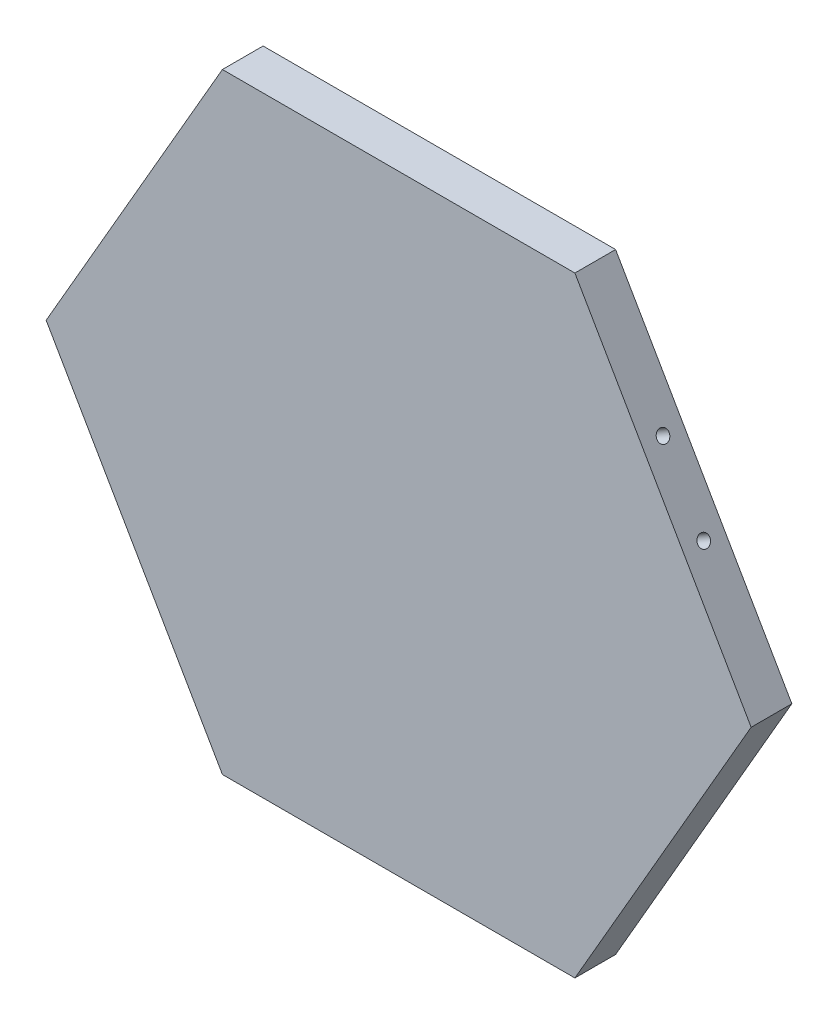
ISO-10303-21;
HEADER;
FILE_DESCRIPTION(('STEP AP214'),'2;1');
FILE_NAME('part.step','',(''),(''),'','','');
FILE_SCHEMA(('AUTOMOTIVE_DESIGN { 1 0 10303 214 1 1 1 1 }'));
ENDSEC;
DATA;
#1=APPLICATION_CONTEXT('core data for automotive mechanical design processes');
#2=APPLICATION_PROTOCOL_DEFINITION('international standard','automotive_design',2000,#1);
#3=PRODUCT_CONTEXT('',#1,'mechanical');
#4=PRODUCT('Part','Part','',(#3));
#5=PRODUCT_RELATED_PRODUCT_CATEGORY('part','',(#4));
#6=PRODUCT_DEFINITION_FORMATION('','',#4);
#7=PRODUCT_DEFINITION_CONTEXT('part definition',#1,'design');
#8=PRODUCT_DEFINITION('design','',#6,#7);
#9=PRODUCT_DEFINITION_SHAPE('','',#8);
#10=(LENGTH_UNIT() NAMED_UNIT(*) SI_UNIT(.MILLI.,.METRE.));
#11=(NAMED_UNIT(*) PLANE_ANGLE_UNIT() SI_UNIT($,.RADIAN.));
#12=(NAMED_UNIT(*) SI_UNIT($,.STERADIAN.) SOLID_ANGLE_UNIT());
#13=UNCERTAINTY_MEASURE_WITH_UNIT(LENGTH_MEASURE(1.E-05),#10,'distance_accuracy_value','');
#14=(GEOMETRIC_REPRESENTATION_CONTEXT(3) GLOBAL_UNCERTAINTY_ASSIGNED_CONTEXT((#13)) GLOBAL_UNIT_ASSIGNED_CONTEXT((#10,
#11,#12)) REPRESENTATION_CONTEXT('',''));
#15=CARTESIAN_POINT('',(0.,0.,0.));
#16=DIRECTION('',(0.,0.,1.));
#17=DIRECTION('',(1.,0.,0.));
#18=AXIS2_PLACEMENT_3D('',#15,#16,#17);
#19=CARTESIAN_POINT('',(43.3012701892226,-74.9999999999991,10.));
#20=DIRECTION('',(-0.866025403784441,0.499999999999995,0.));
#21=DIRECTION('',(-0.499999999999995,-0.866025403784441,0.));
#22=AXIS2_PLACEMENT_3D('',#19,#20,#21);
#23=PLANE('',#22);
#24=DIRECTION('',(0.499999999999995,0.866025403784441,0.));
#25=VECTOR('',#24,1.);
#26=CARTESIAN_POINT('',(43.3012701892226,-74.9999999999991,0.));
#27=LINE('',#26,#25);
#28=CARTESIAN_POINT('',(43.3012701892226,-74.9999999999991,0.));
#29=VERTEX_POINT('',#28);
#30=CARTESIAN_POINT('',(86.6025403784434,0.,0.));
#31=VERTEX_POINT('',#30);
#32=EDGE_CURVE('E132',#29,#31,#27,.T.);
#33=ORIENTED_EDGE('',*,*,#32,.T.);
#34=DIRECTION('',(0.,0.,-1.));
#35=VECTOR('',#34,1.);
#36=CARTESIAN_POINT('',(86.6025403784434,0.,10.));
#37=LINE('',#36,#35);
#38=CARTESIAN_POINT('',(86.6025403784434,0.,10.));
#39=VERTEX_POINT('',#38);
#40=EDGE_CURVE('E11',#39,#31,#37,.T.);
#41=ORIENTED_EDGE('',*,*,#40,.F.);
#42=DIRECTION('',(0.499999999999995,0.866025403784441,0.));
#43=VECTOR('',#42,1.);
#44=CARTESIAN_POINT('',(43.3012701892226,-74.9999999999991,10.));
#45=LINE('',#44,#43);
#46=CARTESIAN_POINT('',(43.3012701892226,-74.9999999999991,10.));
#47=VERTEX_POINT('',#46);
#48=EDGE_CURVE('E149',#47,#39,#45,.T.);
#49=ORIENTED_EDGE('',*,*,#48,.F.);
#50=DIRECTION('',(0.,0.,-1.));
#51=VECTOR('',#50,1.);
#52=CARTESIAN_POINT('',(43.3012701892226,-74.9999999999991,10.));
#53=LINE('',#52,#51);
#54=EDGE_CURVE('E128',#47,#29,#53,.T.);
#55=ORIENTED_EDGE('',*,*,#54,.T.);
#56=EDGE_LOOP('',(#33,#41,#49,#55));
#57=FACE_BOUND('',#56,.T.);
#58=ADVANCED_FACE('F43',(#57),#23,.F.);
#59=CARTESIAN_POINT('',(86.6025403784434,0.,10.));
#60=DIRECTION('',(-0.866025403784438,-0.500000000000001,0.));
#61=DIRECTION('',(0.500000000000001,-0.866025403784438,0.));
#62=AXIS2_PLACEMENT_3D('',#59,#60,#61);
#63=PLANE('',#62);
#64=CARTESIAN_POINT('',(69.9519052838321,28.8397459621565,5.));
#65=DIRECTION('',(0.866025403784431,0.500000000000013,0.));
#66=DIRECTION('',(-0.500000000000013,0.866025403784431,0.));
#67=AXIS2_PLACEMENT_3D('',#64,#65,#66);
#68=CIRCLE('',#67,1.5);
#69=CARTESIAN_POINT('',(69.2019052838321,30.1387840678331,5.));
#70=VERTEX_POINT('',#69);
#71=EDGE_CURVE('E235',#70,#70,#68,.T.);
#72=ORIENTED_EDGE('',*,*,#71,.F.);
#73=EDGE_LOOP('',(#72));
#74=FACE_BOUND('',#73,.T.);
#75=CARTESIAN_POINT('',(59.9519052838318,46.1602540378451,5.));
#76=DIRECTION('',(0.866025403784431,0.500000000000013,0.));
#77=DIRECTION('',(-0.500000000000013,0.866025403784431,0.));
#78=AXIS2_PLACEMENT_3D('',#75,#76,#77);
#79=CIRCLE('',#78,1.5);
#80=CARTESIAN_POINT('',(59.2019052838318,47.4592921435217,5.));
#81=VERTEX_POINT('',#80);
#82=EDGE_CURVE('E243',#81,#81,#79,.T.);
#83=ORIENTED_EDGE('',*,*,#82,.F.);
#84=EDGE_LOOP('',(#83));
#85=FACE_BOUND('',#84,.T.);
#86=DIRECTION('',(-0.500000000000001,0.866025403784438,0.));
#87=VECTOR('',#86,1.);
#88=CARTESIAN_POINT('',(86.6025403784434,0.,0.));
#89=LINE('',#88,#87);
#90=CARTESIAN_POINT('',(43.3012701892215,74.9999999999997,0.));
#91=VERTEX_POINT('',#90);
#92=EDGE_CURVE('E136',#31,#91,#89,.T.);
#93=ORIENTED_EDGE('',*,*,#92,.T.);
#94=DIRECTION('',(0.,0.,-1.));
#95=VECTOR('',#94,1.);
#96=CARTESIAN_POINT('',(43.3012701892215,74.9999999999997,10.));
#97=LINE('',#96,#95);
#98=CARTESIAN_POINT('',(43.3012701892215,74.9999999999997,10.));
#99=VERTEX_POINT('',#98);
#100=EDGE_CURVE('E52',#99,#91,#97,.T.);
#101=ORIENTED_EDGE('',*,*,#100,.F.);
#102=DIRECTION('',(-0.500000000000001,0.866025403784438,0.));
#103=VECTOR('',#102,1.);
#104=CARTESIAN_POINT('',(86.6025403784434,0.,10.));
#105=LINE('',#104,#103);
#106=EDGE_CURVE('E97',#39,#99,#105,.T.);
#107=ORIENTED_EDGE('',*,*,#106,.F.);
#108=ORIENTED_EDGE('',*,*,#40,.T.);
#109=EDGE_LOOP('',(#93,#101,#107,#108));
#110=FACE_BOUND('',#109,.T.);
#111=ADVANCED_FACE('F180',(#74,#85,#110),#63,.F.);
#112=CARTESIAN_POINT('',(43.3012701892215,74.9999999999997,10.));
#113=DIRECTION('',(0.,-1.,0.));
#114=DIRECTION('',(1.,0.,0.));
#115=AXIS2_PLACEMENT_3D('',#112,#113,#114);
#116=PLANE('',#115);
#117=DIRECTION('',(-1.,0.,0.));
#118=VECTOR('',#117,1.);
#119=CARTESIAN_POINT('',(43.3012701892215,74.9999999999997,0.));
#120=LINE('',#119,#118);
#121=CARTESIAN_POINT('',(-43.301270189222,74.9999999999994,0.));
#122=VERTEX_POINT('',#121);
#123=EDGE_CURVE('E140',#91,#122,#120,.T.);
#124=ORIENTED_EDGE('',*,*,#123,.T.);
#125=DIRECTION('',(0.,0.,-1.));
#126=VECTOR('',#125,1.);
#127=CARTESIAN_POINT('',(-43.301270189222,74.9999999999994,10.));
#128=LINE('',#127,#126);
#129=CARTESIAN_POINT('',(-43.301270189222,74.9999999999994,10.));
#130=VERTEX_POINT('',#129);
#131=EDGE_CURVE('E121',#130,#122,#128,.T.);
#132=ORIENTED_EDGE('',*,*,#131,.F.);
#133=DIRECTION('',(-1.,0.,0.));
#134=VECTOR('',#133,1.);
#135=CARTESIAN_POINT('',(43.3012701892215,74.9999999999997,10.));
#136=LINE('',#135,#134);
#137=EDGE_CURVE('E110',#99,#130,#136,.T.);
#138=ORIENTED_EDGE('',*,*,#137,.F.);
#139=ORIENTED_EDGE('',*,*,#100,.T.);
#140=EDGE_LOOP('',(#124,#132,#138,#139));
#141=FACE_BOUND('',#140,.T.);
#142=ADVANCED_FACE('F159',(#141),#116,.F.);
#143=CARTESIAN_POINT('',(-43.301270189222,74.9999999999994,10.));
#144=DIRECTION('',(0.866025403784442,-0.499999999999995,0.));
#145=DIRECTION('',(0.499999999999995,0.866025403784442,0.));
#146=AXIS2_PLACEMENT_3D('',#143,#144,#145);
#147=PLANE('',#146);
#148=CARTESIAN_POINT('',(-59.9519052838334,46.160254037843,5.));
#149=DIRECTION('',(-0.866025403784449,0.499999999999983,0.));
#150=DIRECTION('',(-0.499999999999983,-0.866025403784449,0.));
#151=AXIS2_PLACEMENT_3D('',#148,#149,#150);
#152=CIRCLE('',#151,1.5);
#153=CARTESIAN_POINT('',(-60.7019052838334,44.8612159321663,5.));
#154=VERTEX_POINT('',#153);
#155=EDGE_CURVE('E199',#154,#154,#152,.T.);
#156=ORIENTED_EDGE('',*,*,#155,.F.);
#157=EDGE_LOOP('',(#156));
#158=FACE_BOUND('',#157,.T.);
#159=CARTESIAN_POINT('',(-69.9519052838331,28.839745962154,5.));
#160=DIRECTION('',(-0.866025403784449,0.499999999999983,0.));
#161=DIRECTION('',(-0.499999999999983,-0.866025403784449,0.));
#162=AXIS2_PLACEMENT_3D('',#159,#160,#161);
#163=CIRCLE('',#162,1.5);
#164=CARTESIAN_POINT('',(-70.7019052838331,27.5407078564773,5.));
#165=VERTEX_POINT('',#164);
#166=EDGE_CURVE('E202',#165,#165,#163,.T.);
#167=ORIENTED_EDGE('',*,*,#166,.F.);
#168=EDGE_LOOP('',(#167));
#169=FACE_BOUND('',#168,.T.);
#170=DIRECTION('',(-0.499999999999995,-0.866025403784441,0.));
#171=VECTOR('',#170,1.);
#172=CARTESIAN_POINT('',(-43.301270189222,74.9999999999994,0.));
#173=LINE('',#172,#171);
#174=CARTESIAN_POINT('',(-86.6025403784434,-6.03683769639929E-13,0.));
#175=VERTEX_POINT('',#174);
#176=EDGE_CURVE('E119',#122,#175,#173,.T.);
#177=ORIENTED_EDGE('',*,*,#176,.T.);
#178=DIRECTION('',(0.,0.,-1.));
#179=VECTOR('',#178,1.);
#180=CARTESIAN_POINT('',(-86.6025403784434,-6.03683769639929E-13,10.));
#181=LINE('',#180,#179);
#182=CARTESIAN_POINT('',(-86.6025403784434,-6.03683769639929E-13,10.));
#183=VERTEX_POINT('',#182);
#184=EDGE_CURVE('E116',#183,#175,#181,.T.);
#185=ORIENTED_EDGE('',*,*,#184,.F.);
#186=DIRECTION('',(-0.499999999999995,-0.866025403784441,0.));
#187=VECTOR('',#186,1.);
#188=CARTESIAN_POINT('',(-43.301270189222,74.9999999999994,10.));
#189=LINE('',#188,#187);
#190=EDGE_CURVE('E104',#130,#183,#189,.T.);
#191=ORIENTED_EDGE('',*,*,#190,.F.);
#192=ORIENTED_EDGE('',*,*,#131,.T.);
#193=EDGE_LOOP('',(#177,#185,#191,#192));
#194=FACE_BOUND('',#193,.T.);
#195=ADVANCED_FACE('F117',(#158,#169,#194),#147,.F.);
#196=CARTESIAN_POINT('',(-86.6025403784434,-6.03683769639929E-13,10.));
#197=DIRECTION('',(0.866025403784435,0.500000000000007,0.));
#198=DIRECTION('',(-0.500000000000007,0.866025403784435,0.));
#199=AXIS2_PLACEMENT_3D('',#196,#197,#198);
#200=PLANE('',#199);
#201=DIRECTION('',(0.500000000000007,-0.866025403784435,0.));
#202=VECTOR('',#201,1.);
#203=CARTESIAN_POINT('',(-86.6025403784434,-6.03683769639929E-13,0.));
#204=LINE('',#203,#202);
#205=CARTESIAN_POINT('',(-43.301270189221,-75.,0.));
#206=VERTEX_POINT('',#205);
#207=EDGE_CURVE('E83',#175,#206,#204,.T.);
#208=ORIENTED_EDGE('',*,*,#207,.T.);
#209=DIRECTION('',(0.,0.,-1.));
#210=VECTOR('',#209,1.);
#211=CARTESIAN_POINT('',(-43.301270189221,-75.,10.));
#212=LINE('',#211,#210);
#213=CARTESIAN_POINT('',(-43.301270189221,-75.,10.));
#214=VERTEX_POINT('',#213);
#215=EDGE_CURVE('E122',#214,#206,#212,.T.);
#216=ORIENTED_EDGE('',*,*,#215,.F.);
#217=DIRECTION('',(0.500000000000007,-0.866025403784435,0.));
#218=VECTOR('',#217,1.);
#219=CARTESIAN_POINT('',(-86.6025403784434,-6.03683769639929E-13,10.));
#220=LINE('',#219,#218);
#221=EDGE_CURVE('E108',#183,#214,#220,.T.);
#222=ORIENTED_EDGE('',*,*,#221,.F.);
#223=ORIENTED_EDGE('',*,*,#184,.T.);
#224=EDGE_LOOP('',(#208,#216,#222,#223));
#225=FACE_BOUND('',#224,.T.);
#226=ADVANCED_FACE('F124',(#225),#200,.F.);
#227=CARTESIAN_POINT('',(-43.301270189221,-75.,10.));
#228=DIRECTION('',(0.,1.,0.));
#229=DIRECTION('',(-1.,0.,0.));
#230=AXIS2_PLACEMENT_3D('',#227,#228,#229);
#231=PLANE('',#230);
#232=CARTESIAN_POINT('',(-9.99999999999921,-74.9999999999997,5.));
#233=DIRECTION('',(0.,-1.,0.));
#234=DIRECTION('',(1.,0.,0.));
#235=AXIS2_PLACEMENT_3D('',#232,#233,#234);
#236=CIRCLE('',#235,1.5);
#237=CARTESIAN_POINT('',(-8.49999999999921,-74.9999999999996,5.));
#238=VERTEX_POINT('',#237);
#239=EDGE_CURVE('E215',#238,#238,#236,.T.);
#240=ORIENTED_EDGE('',*,*,#239,.F.);
#241=EDGE_LOOP('',(#240));
#242=FACE_BOUND('',#241,.T.);
#243=CARTESIAN_POINT('',(10.0000000000008,-74.9999999999994,5.));
#244=DIRECTION('',(0.,-1.,0.));
#245=DIRECTION('',(1.,0.,0.));
#246=AXIS2_PLACEMENT_3D('',#243,#244,#245);
#247=CIRCLE('',#246,1.5);
#248=CARTESIAN_POINT('',(11.5000000000008,-74.9999999999994,5.));
#249=VERTEX_POINT('',#248);
#250=EDGE_CURVE('E219',#249,#249,#247,.T.);
#251=ORIENTED_EDGE('',*,*,#250,.F.);
#252=EDGE_LOOP('',(#251));
#253=FACE_BOUND('',#252,.T.);
#254=DIRECTION('',(1.,0.,0.));
#255=VECTOR('',#254,1.);
#256=CARTESIAN_POINT('',(-43.301270189221,-75.,0.));
#257=LINE('',#256,#255);
#258=EDGE_CURVE('E89',#206,#29,#257,.T.);
#259=ORIENTED_EDGE('',*,*,#258,.T.);
#260=ORIENTED_EDGE('',*,*,#54,.F.);
#261=DIRECTION('',(1.,0.,0.));
#262=VECTOR('',#261,1.);
#263=CARTESIAN_POINT('',(-43.301270189221,-75.,10.));
#264=LINE('',#263,#262);
#265=EDGE_CURVE('E60',#214,#47,#264,.T.);
#266=ORIENTED_EDGE('',*,*,#265,.F.);
#267=ORIENTED_EDGE('',*,*,#215,.T.);
#268=EDGE_LOOP('',(#259,#260,#266,#267));
#269=FACE_BOUND('',#268,.T.);
#270=ADVANCED_FACE('F166',(#242,#253,#269),#231,.F.);
#271=CARTESIAN_POINT('',(0.,0.,10.));
#272=DIRECTION('',(0.,0.,1.));
#273=DIRECTION('',(1.,0.,0.));
#274=AXIS2_PLACEMENT_3D('',#271,#272,#273);
#275=PLANE('',#274);
#276=ORIENTED_EDGE('',*,*,#48,.T.);
#277=ORIENTED_EDGE('',*,*,#106,.T.);
#278=ORIENTED_EDGE('',*,*,#137,.T.);
#279=ORIENTED_EDGE('',*,*,#190,.T.);
#280=ORIENTED_EDGE('',*,*,#221,.T.);
#281=ORIENTED_EDGE('',*,*,#265,.T.);
#282=EDGE_LOOP('',(#276,#277,#278,#279,#280,#281));
#283=FACE_BOUND('',#282,.T.);
#284=ADVANCED_FACE('F106',(#283),#275,.T.);
#285=CARTESIAN_POINT('',(0.,0.,0.));
#286=DIRECTION('',(0.,0.,1.));
#287=DIRECTION('',(1.,0.,0.));
#288=AXIS2_PLACEMENT_3D('',#285,#286,#287);
#289=PLANE('',#288);
#290=ORIENTED_EDGE('',*,*,#32,.F.);
#291=ORIENTED_EDGE('',*,*,#258,.F.);
#292=ORIENTED_EDGE('',*,*,#207,.F.);
#293=ORIENTED_EDGE('',*,*,#176,.F.);
#294=ORIENTED_EDGE('',*,*,#123,.F.);
#295=ORIENTED_EDGE('',*,*,#92,.F.);
#296=EDGE_LOOP('',(#290,#291,#292,#293,#294,#295));
#297=FACE_BOUND('',#296,.T.);
#298=ADVANCED_FACE('F162',(#297),#289,.F.);
#299=CARTESIAN_POINT('',(10.0000000000007,-69.9999999999994,5.));
#300=DIRECTION('',(0.,-1.,0.));
#301=DIRECTION('',(1.,0.,0.));
#302=AXIS2_PLACEMENT_3D('',#299,#300,#301);
#303=CYLINDRICAL_SURFACE('',#302,1.5);
#304=CARTESIAN_POINT('',(10.0000000000007,-69.9999999999994,5.));
#305=DIRECTION('',(0.,-1.,0.));
#306=DIRECTION('',(1.,0.,0.));
#307=AXIS2_PLACEMENT_3D('',#304,#305,#306);
#308=CIRCLE('',#307,1.5);
#309=CARTESIAN_POINT('',(11.5000000000007,-69.9999999999994,5.));
#310=VERTEX_POINT('',#309);
#311=EDGE_CURVE('E223',#310,#310,#308,.T.);
#312=ORIENTED_EDGE('',*,*,#311,.F.);
#313=EDGE_LOOP('',(#312));
#314=FACE_BOUND('',#313,.T.);
#315=ORIENTED_EDGE('',*,*,#250,.T.);
#316=EDGE_LOOP('',(#315));
#317=FACE_BOUND('',#316,.T.);
#318=ADVANCED_FACE('F284',(#314,#317),#303,.F.);
#319=CARTESIAN_POINT('',(10.0000000000007,-69.9999999999994,5.));
#320=DIRECTION('',(0.,-1.,0.));
#321=DIRECTION('',(1.,0.,0.));
#322=AXIS2_PLACEMENT_3D('',#319,#320,#321);
#323=PLANE('',#322);
#324=ORIENTED_EDGE('',*,*,#311,.T.);
#325=EDGE_LOOP('',(#324));
#326=FACE_BOUND('',#325,.T.);
#327=ADVANCED_FACE('F282',(#326),#323,.T.);
#328=CARTESIAN_POINT('',(-9.99999999999926,-69.9999999999997,5.));
#329=DIRECTION('',(0.,-1.,0.));
#330=DIRECTION('',(1.,0.,0.));
#331=AXIS2_PLACEMENT_3D('',#328,#329,#330);
#332=CYLINDRICAL_SURFACE('',#331,1.5);
#333=CARTESIAN_POINT('',(-9.99999999999926,-69.9999999999997,5.));
#334=DIRECTION('',(0.,-1.,0.));
#335=DIRECTION('',(1.,0.,0.));
#336=AXIS2_PLACEMENT_3D('',#333,#334,#335);
#337=CIRCLE('',#336,1.5);
#338=CARTESIAN_POINT('',(-8.49999999999926,-69.9999999999996,5.));
#339=VERTEX_POINT('',#338);
#340=EDGE_CURVE('E137',#339,#339,#337,.T.);
#341=ORIENTED_EDGE('',*,*,#340,.F.);
#342=EDGE_LOOP('',(#341));
#343=FACE_BOUND('',#342,.T.);
#344=ORIENTED_EDGE('',*,*,#239,.T.);
#345=EDGE_LOOP('',(#344));
#346=FACE_BOUND('',#345,.T.);
#347=ADVANCED_FACE('F278',(#343,#346),#332,.F.);
#348=CARTESIAN_POINT('',(-9.99999999999926,-69.9999999999997,5.));
#349=DIRECTION('',(0.,-1.,0.));
#350=DIRECTION('',(1.,0.,0.));
#351=AXIS2_PLACEMENT_3D('',#348,#349,#350);
#352=PLANE('',#351);
#353=ORIENTED_EDGE('',*,*,#340,.T.);
#354=EDGE_LOOP('',(#353));
#355=FACE_BOUND('',#354,.T.);
#356=ADVANCED_FACE('F274',(#355),#352,.T.);
#357=CARTESIAN_POINT('',(-65.6217782649108,26.3397459621541,5.));
#358=DIRECTION('',(-0.866025403784449,0.499999999999983,0.));
#359=DIRECTION('',(-0.499999999999983,-0.866025403784449,0.));
#360=AXIS2_PLACEMENT_3D('',#357,#358,#359);
#361=CYLINDRICAL_SURFACE('',#360,1.5);
#362=CARTESIAN_POINT('',(-65.6217782649108,26.3397459621541,5.));
#363=DIRECTION('',(-0.866025403784449,0.499999999999983,0.));
#364=DIRECTION('',(-0.499999999999983,-0.866025403784449,0.));
#365=AXIS2_PLACEMENT_3D('',#362,#363,#364);
#366=CIRCLE('',#365,1.5);
#367=CARTESIAN_POINT('',(-66.3717782649108,25.0407078564774,5.));
#368=VERTEX_POINT('',#367);
#369=EDGE_CURVE('E205',#368,#368,#366,.T.);
#370=ORIENTED_EDGE('',*,*,#369,.F.);
#371=EDGE_LOOP('',(#370));
#372=FACE_BOUND('',#371,.T.);
#373=ORIENTED_EDGE('',*,*,#166,.T.);
#374=EDGE_LOOP('',(#373));
#375=FACE_BOUND('',#374,.T.);
#376=ADVANCED_FACE('F266',(#372,#375),#361,.F.);
#377=CARTESIAN_POINT('',(-65.6217782649108,26.3397459621541,5.));
#378=DIRECTION('',(-0.866025403784449,0.499999999999983,0.));
#379=DIRECTION('',(-0.499999999999983,-0.866025403784449,0.));
#380=AXIS2_PLACEMENT_3D('',#377,#378,#379);
#381=PLANE('',#380);
#382=ORIENTED_EDGE('',*,*,#369,.T.);
#383=EDGE_LOOP('',(#382));
#384=FACE_BOUND('',#383,.T.);
#385=ADVANCED_FACE('F256',(#384),#381,.T.);
#386=CARTESIAN_POINT('',(-55.6217782649112,43.6602540378431,5.));
#387=DIRECTION('',(-0.866025403784449,0.499999999999983,0.));
#388=DIRECTION('',(-0.499999999999983,-0.866025403784449,0.));
#389=AXIS2_PLACEMENT_3D('',#386,#387,#388);
#390=CYLINDRICAL_SURFACE('',#389,1.5);
#391=CARTESIAN_POINT('',(-55.6217782649112,43.6602540378431,5.));
#392=DIRECTION('',(-0.866025403784449,0.499999999999983,0.));
#393=DIRECTION('',(-0.499999999999983,-0.866025403784449,0.));
#394=AXIS2_PLACEMENT_3D('',#391,#392,#393);
#395=CIRCLE('',#394,1.5);
#396=CARTESIAN_POINT('',(-56.3717782649111,42.3612159321664,5.));
#397=VERTEX_POINT('',#396);
#398=EDGE_CURVE('E247',#397,#397,#395,.T.);
#399=ORIENTED_EDGE('',*,*,#398,.F.);
#400=EDGE_LOOP('',(#399));
#401=FACE_BOUND('',#400,.T.);
#402=ORIENTED_EDGE('',*,*,#155,.T.);
#403=EDGE_LOOP('',(#402));
#404=FACE_BOUND('',#403,.T.);
#405=ADVANCED_FACE('F253',(#401,#404),#390,.F.);
#406=CARTESIAN_POINT('',(-55.6217782649112,43.6602540378431,5.));
#407=DIRECTION('',(-0.866025403784449,0.499999999999983,0.));
#408=DIRECTION('',(-0.499999999999983,-0.866025403784449,0.));
#409=AXIS2_PLACEMENT_3D('',#406,#407,#408);
#410=PLANE('',#409);
#411=ORIENTED_EDGE('',*,*,#398,.T.);
#412=EDGE_LOOP('',(#411));
#413=FACE_BOUND('',#412,.T.);
#414=ADVANCED_FACE('F255',(#413),#410,.T.);
#415=CARTESIAN_POINT('',(55.6217782649097,43.660254037845,5.));
#416=DIRECTION('',(0.866025403784431,0.500000000000013,0.));
#417=DIRECTION('',(-0.500000000000013,0.866025403784431,0.));
#418=AXIS2_PLACEMENT_3D('',#415,#416,#417);
#419=CYLINDRICAL_SURFACE('',#418,1.5);
#420=CARTESIAN_POINT('',(55.6217782649097,43.660254037845,5.));
#421=DIRECTION('',(0.866025403784431,0.500000000000013,0.));
#422=DIRECTION('',(-0.500000000000013,0.866025403784431,0.));
#423=AXIS2_PLACEMENT_3D('',#420,#421,#422);
#424=CIRCLE('',#423,1.5);
#425=CARTESIAN_POINT('',(54.8717782649096,44.9592921435217,5.));
#426=VERTEX_POINT('',#425);
#427=EDGE_CURVE('E239',#426,#426,#424,.T.);
#428=ORIENTED_EDGE('',*,*,#427,.F.);
#429=EDGE_LOOP('',(#428));
#430=FACE_BOUND('',#429,.T.);
#431=ORIENTED_EDGE('',*,*,#82,.T.);
#432=EDGE_LOOP('',(#431));
#433=FACE_BOUND('',#432,.T.);
#434=ADVANCED_FACE('F263',(#430,#433),#419,.F.);
#435=CARTESIAN_POINT('',(55.6217782649097,43.660254037845,5.));
#436=DIRECTION('',(0.866025403784431,0.500000000000013,0.));
#437=DIRECTION('',(-0.500000000000013,0.866025403784431,0.));
#438=AXIS2_PLACEMENT_3D('',#435,#436,#437);
#439=PLANE('',#438);
#440=ORIENTED_EDGE('',*,*,#427,.T.);
#441=EDGE_LOOP('',(#440));
#442=FACE_BOUND('',#441,.T.);
#443=ADVANCED_FACE('F341',(#442),#439,.T.);
#444=CARTESIAN_POINT('',(65.6217782649099,26.3397459621564,5.));
#445=DIRECTION('',(0.866025403784431,0.500000000000013,0.));
#446=DIRECTION('',(-0.500000000000013,0.866025403784431,0.));
#447=AXIS2_PLACEMENT_3D('',#444,#445,#446);
#448=CYLINDRICAL_SURFACE('',#447,1.5);
#449=CARTESIAN_POINT('',(65.6217782649099,26.3397459621564,5.));
#450=DIRECTION('',(0.866025403784431,0.500000000000013,0.));
#451=DIRECTION('',(-0.500000000000013,0.866025403784431,0.));
#452=AXIS2_PLACEMENT_3D('',#449,#450,#451);
#453=CIRCLE('',#452,1.5);
#454=CARTESIAN_POINT('',(64.8717782649099,27.638784067833,5.));
#455=VERTEX_POINT('',#454);
#456=EDGE_CURVE('E227',#455,#455,#453,.T.);
#457=ORIENTED_EDGE('',*,*,#456,.F.);
#458=EDGE_LOOP('',(#457));
#459=FACE_BOUND('',#458,.T.);
#460=ORIENTED_EDGE('',*,*,#71,.T.);
#461=EDGE_LOOP('',(#460));
#462=FACE_BOUND('',#461,.T.);
#463=ADVANCED_FACE('F351',(#459,#462),#448,.F.);
#464=CARTESIAN_POINT('',(65.6217782649099,26.3397459621564,5.));
#465=DIRECTION('',(0.866025403784431,0.500000000000013,0.));
#466=DIRECTION('',(-0.500000000000013,0.866025403784431,0.));
#467=AXIS2_PLACEMENT_3D('',#464,#465,#466);
#468=PLANE('',#467);
#469=ORIENTED_EDGE('',*,*,#456,.T.);
#470=EDGE_LOOP('',(#469));
#471=FACE_BOUND('',#470,.T.);
#472=ADVANCED_FACE('F362',(#471),#468,.T.);
#473=CLOSED_SHELL('',(#58,#111,#142,#195,#226,#270,#284,#298,#318,#327,#347,#356,#376,#385,#405,
#414,#434,#443,#463,#472));
#474=MANIFOLD_SOLID_BREP('B2',#473);
#475=ADVANCED_BREP_SHAPE_REPRESENTATION('',(#18,#474),#14);
#476=SHAPE_DEFINITION_REPRESENTATION(#9,#475);
ENDSEC;
END-ISO-10303-21;
